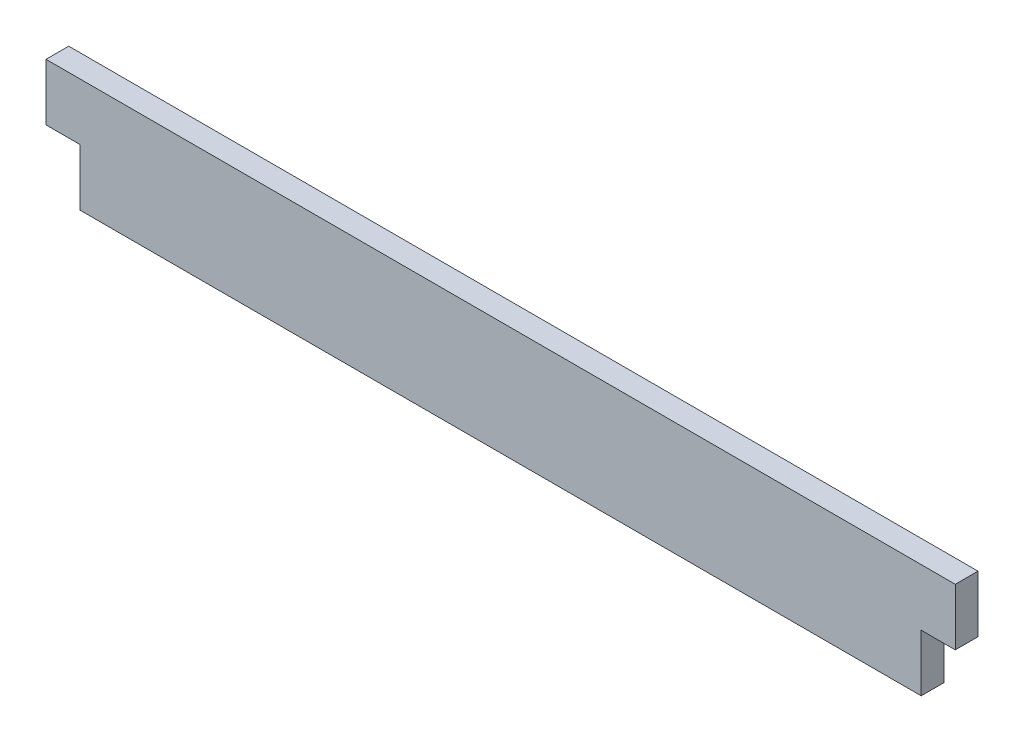
ISO-10303-21;
HEADER;
FILE_DESCRIPTION(('STEP AP214'),'2;1');
FILE_NAME('part.step','',(''),(''),'','','');
FILE_SCHEMA(('AUTOMOTIVE_DESIGN { 1 0 10303 214 1 1 1 1 }'));
ENDSEC;
DATA;
#1=APPLICATION_CONTEXT('core data for automotive mechanical design processes');
#2=APPLICATION_PROTOCOL_DEFINITION('international standard','automotive_design',2000,#1);
#3=PRODUCT_CONTEXT('',#1,'mechanical');
#4=PRODUCT('Part','Part','',(#3));
#5=PRODUCT_RELATED_PRODUCT_CATEGORY('part','',(#4));
#6=PRODUCT_DEFINITION_FORMATION('','',#4);
#7=PRODUCT_DEFINITION_CONTEXT('part definition',#1,'design');
#8=PRODUCT_DEFINITION('design','',#6,#7);
#9=PRODUCT_DEFINITION_SHAPE('','',#8);
#10=(LENGTH_UNIT() NAMED_UNIT(*) SI_UNIT(.MILLI.,.METRE.));
#11=(NAMED_UNIT(*) PLANE_ANGLE_UNIT() SI_UNIT($,.RADIAN.));
#12=(NAMED_UNIT(*) SI_UNIT($,.STERADIAN.) SOLID_ANGLE_UNIT());
#13=UNCERTAINTY_MEASURE_WITH_UNIT(LENGTH_MEASURE(1.E-05),#10,'distance_accuracy_value','');
#14=(GEOMETRIC_REPRESENTATION_CONTEXT(3) GLOBAL_UNCERTAINTY_ASSIGNED_CONTEXT((#13)) GLOBAL_UNIT_ASSIGNED_CONTEXT((#10,
#11,#12)) REPRESENTATION_CONTEXT('',''));
#15=CARTESIAN_POINT('',(0.,0.,0.));
#16=DIRECTION('',(0.,0.,1.));
#17=DIRECTION('',(1.,0.,0.));
#18=AXIS2_PLACEMENT_3D('',#15,#16,#17);
#19=CARTESIAN_POINT('',(-40.,-5.,2.));
#20=DIRECTION('',(1.,0.,0.));
#21=DIRECTION('',(0.,0.,-1.));
#22=AXIS2_PLACEMENT_3D('',#19,#20,#21);
#23=PLANE('',#22);
#24=DIRECTION('',(0.,-1.,0.));
#25=VECTOR('',#24,1.);
#26=CARTESIAN_POINT('',(-40.,-5.,0.));
#27=LINE('',#26,#25);
#28=CARTESIAN_POINT('',(-40.,5.,0.));
#29=VERTEX_POINT('',#28);
#30=CARTESIAN_POINT('',(-40.,0.,0.));
#31=VERTEX_POINT('',#30);
#32=EDGE_CURVE('E131',#29,#31,#27,.T.);
#33=ORIENTED_EDGE('',*,*,#32,.T.);
#34=DIRECTION('',(0.,0.,-1.));
#35=VECTOR('',#34,1.);
#36=CARTESIAN_POINT('',(-40.,0.,2.));
#37=LINE('',#36,#35);
#38=CARTESIAN_POINT('',(-40.,0.,2.));
#39=VERTEX_POINT('',#38);
#40=EDGE_CURVE('E54',#39,#31,#37,.T.);
#41=ORIENTED_EDGE('',*,*,#40,.F.);
#42=DIRECTION('',(0.,-1.,0.));
#43=VECTOR('',#42,1.);
#44=CARTESIAN_POINT('',(-40.,-5.,2.));
#45=LINE('',#44,#43);
#46=CARTESIAN_POINT('',(-40.,5.,2.));
#47=VERTEX_POINT('',#46);
#48=EDGE_CURVE('E121',#47,#39,#45,.T.);
#49=ORIENTED_EDGE('',*,*,#48,.F.);
#50=DIRECTION('',(0.,0.,-1.));
#51=VECTOR('',#50,1.);
#52=CARTESIAN_POINT('',(-40.,5.,2.));
#53=LINE('',#52,#51);
#54=EDGE_CURVE('E39',#47,#29,#53,.T.);
#55=ORIENTED_EDGE('',*,*,#54,.T.);
#56=EDGE_LOOP('',(#33,#41,#49,#55));
#57=FACE_BOUND('',#56,.T.);
#58=ADVANCED_FACE('F32',(#57),#23,.F.);
#59=CARTESIAN_POINT('',(40.,-4.99999999999999,2.));
#60=DIRECTION('',(0.,1.,0.));
#61=DIRECTION('',(-1.,0.,0.));
#62=AXIS2_PLACEMENT_3D('',#59,#60,#61);
#63=PLANE('',#62);
#64=DIRECTION('',(1.,0.,0.));
#65=VECTOR('',#64,1.);
#66=CARTESIAN_POINT('',(40.,-4.99999999999999,0.));
#67=LINE('',#66,#65);
#68=CARTESIAN_POINT('',(-37.,-5.,0.));
#69=VERTEX_POINT('',#68);
#70=CARTESIAN_POINT('',(37.,-4.99999999999999,0.));
#71=VERTEX_POINT('',#70);
#72=EDGE_CURVE('E113',#69,#71,#67,.T.);
#73=ORIENTED_EDGE('',*,*,#72,.T.);
#74=DIRECTION('',(0.,0.,-1.));
#75=VECTOR('',#74,1.);
#76=CARTESIAN_POINT('',(37.,-4.9999999999999,2.));
#77=LINE('',#76,#75);
#78=CARTESIAN_POINT('',(37.,-4.9999999999999,2.));
#79=VERTEX_POINT('',#78);
#80=EDGE_CURVE('E46',#79,#71,#77,.T.);
#81=ORIENTED_EDGE('',*,*,#80,.F.);
#82=DIRECTION('',(1.,0.,0.));
#83=VECTOR('',#82,1.);
#84=CARTESIAN_POINT('',(40.,-4.99999999999999,2.));
#85=LINE('',#84,#83);
#86=CARTESIAN_POINT('',(-37.,-5.,2.));
#87=VERTEX_POINT('',#86);
#88=EDGE_CURVE('E111',#87,#79,#85,.T.);
#89=ORIENTED_EDGE('',*,*,#88,.F.);
#90=DIRECTION('',(0.,0.,-1.));
#91=VECTOR('',#90,1.);
#92=CARTESIAN_POINT('',(-37.,-5.,2.));
#93=LINE('',#92,#91);
#94=EDGE_CURVE('E134',#87,#69,#93,.T.);
#95=ORIENTED_EDGE('',*,*,#94,.T.);
#96=EDGE_LOOP('',(#73,#81,#89,#95));
#97=FACE_BOUND('',#96,.T.);
#98=ADVANCED_FACE('F109',(#97),#63,.F.);
#99=CARTESIAN_POINT('',(40.,-4.99999999999999,2.));
#100=DIRECTION('',(-1.,0.,0.));
#101=DIRECTION('',(0.,0.,1.));
#102=AXIS2_PLACEMENT_3D('',#99,#100,#101);
#103=PLANE('',#102);
#104=DIRECTION('',(0.,1.,0.));
#105=VECTOR('',#104,1.);
#106=CARTESIAN_POINT('',(40.,-4.99999999999999,2.));
#107=LINE('',#106,#105);
#108=CARTESIAN_POINT('',(40.,1.06685493772574E-13,2.));
#109=VERTEX_POINT('',#108);
#110=CARTESIAN_POINT('',(40.,5.00000000000001,2.));
#111=VERTEX_POINT('',#110);
#112=EDGE_CURVE('E120',#109,#111,#107,.T.);
#113=ORIENTED_EDGE('',*,*,#112,.F.);
#114=DIRECTION('',(0.,0.,-1.));
#115=VECTOR('',#114,1.);
#116=CARTESIAN_POINT('',(40.,1.06685493772574E-13,2.));
#117=LINE('',#116,#115);
#118=CARTESIAN_POINT('',(40.,1.06685493772574E-13,0.));
#119=VERTEX_POINT('',#118);
#120=EDGE_CURVE('E152',#109,#119,#117,.T.);
#121=ORIENTED_EDGE('',*,*,#120,.T.);
#122=DIRECTION('',(0.,1.,0.));
#123=VECTOR('',#122,1.);
#124=CARTESIAN_POINT('',(40.,-4.99999999999999,0.));
#125=LINE('',#124,#123);
#126=CARTESIAN_POINT('',(40.,5.00000000000001,0.));
#127=VERTEX_POINT('',#126);
#128=EDGE_CURVE('E136',#119,#127,#125,.T.);
#129=ORIENTED_EDGE('',*,*,#128,.T.);
#130=DIRECTION('',(0.,0.,-1.));
#131=VECTOR('',#130,1.);
#132=CARTESIAN_POINT('',(40.,5.00000000000001,2.));
#133=LINE('',#132,#131);
#134=EDGE_CURVE('E11',#111,#127,#133,.T.);
#135=ORIENTED_EDGE('',*,*,#134,.F.);
#136=EDGE_LOOP('',(#113,#121,#129,#135));
#137=FACE_BOUND('',#136,.T.);
#138=ADVANCED_FACE('F172',(#137),#103,.F.);
#139=CARTESIAN_POINT('',(40.,5.00000000000001,2.));
#140=DIRECTION('',(0.,-1.,0.));
#141=DIRECTION('',(1.,0.,0.));
#142=AXIS2_PLACEMENT_3D('',#139,#140,#141);
#143=PLANE('',#142);
#144=DIRECTION('',(-1.,0.,0.));
#145=VECTOR('',#144,1.);
#146=CARTESIAN_POINT('',(40.,5.00000000000001,0.));
#147=LINE('',#146,#145);
#148=EDGE_CURVE('E126',#127,#29,#147,.T.);
#149=ORIENTED_EDGE('',*,*,#148,.T.);
#150=ORIENTED_EDGE('',*,*,#54,.F.);
#151=DIRECTION('',(-1.,0.,0.));
#152=VECTOR('',#151,1.);
#153=CARTESIAN_POINT('',(40.,5.00000000000001,2.));
#154=LINE('',#153,#152);
#155=EDGE_CURVE('E123',#111,#47,#154,.T.);
#156=ORIENTED_EDGE('',*,*,#155,.F.);
#157=ORIENTED_EDGE('',*,*,#134,.T.);
#158=EDGE_LOOP('',(#149,#150,#156,#157));
#159=FACE_BOUND('',#158,.T.);
#160=ADVANCED_FACE('F173',(#159),#143,.F.);
#161=CARTESIAN_POINT('',(0.,0.,2.));
#162=DIRECTION('',(0.,0.,1.));
#163=DIRECTION('',(1.,0.,0.));
#164=AXIS2_PLACEMENT_3D('',#161,#162,#163);
#165=PLANE('',#164);
#166=DIRECTION('',(1.,0.,0.));
#167=VECTOR('',#166,1.);
#168=CARTESIAN_POINT('',(40.,1.06685493772574E-13,2.));
#169=LINE('',#168,#167);
#170=CARTESIAN_POINT('',(37.,0.,2.));
#171=VERTEX_POINT('',#170);
#172=EDGE_CURVE('E103',#171,#109,#169,.T.);
#173=ORIENTED_EDGE('',*,*,#172,.T.);
#174=ORIENTED_EDGE('',*,*,#112,.T.);
#175=ORIENTED_EDGE('',*,*,#155,.T.);
#176=ORIENTED_EDGE('',*,*,#48,.T.);
#177=DIRECTION('',(1.,0.,0.));
#178=VECTOR('',#177,1.);
#179=CARTESIAN_POINT('',(-40.,0.,2.));
#180=LINE('',#179,#178);
#181=CARTESIAN_POINT('',(-37.,0.,2.));
#182=VERTEX_POINT('',#181);
#183=EDGE_CURVE('E154',#39,#182,#180,.T.);
#184=ORIENTED_EDGE('',*,*,#183,.T.);
#185=DIRECTION('',(0.,-1.,0.));
#186=VECTOR('',#185,1.);
#187=CARTESIAN_POINT('',(-37.,0.,2.));
#188=LINE('',#187,#186);
#189=EDGE_CURVE('E119',#182,#87,#188,.T.);
#190=ORIENTED_EDGE('',*,*,#189,.T.);
#191=ORIENTED_EDGE('',*,*,#88,.T.);
#192=DIRECTION('',(0.,1.,0.));
#193=VECTOR('',#192,1.);
#194=CARTESIAN_POINT('',(37.,0.,2.));
#195=LINE('',#194,#193);
#196=EDGE_CURVE('E96',#79,#171,#195,.T.);
#197=ORIENTED_EDGE('',*,*,#196,.T.);
#198=EDGE_LOOP('',(#173,#174,#175,#176,#184,#190,#191,#197));
#199=FACE_BOUND('',#198,.T.);
#200=ADVANCED_FACE('F116',(#199),#165,.T.);
#201=CARTESIAN_POINT('',(0.,0.,0.));
#202=DIRECTION('',(0.,0.,1.));
#203=DIRECTION('',(1.,0.,0.));
#204=AXIS2_PLACEMENT_3D('',#201,#202,#203);
#205=PLANE('',#204);
#206=ORIENTED_EDGE('',*,*,#128,.F.);
#207=DIRECTION('',(1.,0.,0.));
#208=VECTOR('',#207,1.);
#209=CARTESIAN_POINT('',(40.,1.06685493772574E-13,0.));
#210=LINE('',#209,#208);
#211=CARTESIAN_POINT('',(37.,0.,0.));
#212=VERTEX_POINT('',#211);
#213=EDGE_CURVE('E104',#212,#119,#210,.T.);
#214=ORIENTED_EDGE('',*,*,#213,.F.);
#215=DIRECTION('',(0.,1.,0.));
#216=VECTOR('',#215,1.);
#217=CARTESIAN_POINT('',(37.,0.,0.));
#218=LINE('',#217,#216);
#219=EDGE_CURVE('E166',#71,#212,#218,.T.);
#220=ORIENTED_EDGE('',*,*,#219,.F.);
#221=ORIENTED_EDGE('',*,*,#72,.F.);
#222=DIRECTION('',(0.,-1.,0.));
#223=VECTOR('',#222,1.);
#224=CARTESIAN_POINT('',(-37.,0.,0.));
#225=LINE('',#224,#223);
#226=CARTESIAN_POINT('',(-37.,0.,0.));
#227=VERTEX_POINT('',#226);
#228=EDGE_CURVE('E151',#227,#69,#225,.T.);
#229=ORIENTED_EDGE('',*,*,#228,.F.);
#230=DIRECTION('',(1.,0.,0.));
#231=VECTOR('',#230,1.);
#232=CARTESIAN_POINT('',(-40.,0.,0.));
#233=LINE('',#232,#231);
#234=EDGE_CURVE('E150',#31,#227,#233,.T.);
#235=ORIENTED_EDGE('',*,*,#234,.F.);
#236=ORIENTED_EDGE('',*,*,#32,.F.);
#237=ORIENTED_EDGE('',*,*,#148,.F.);
#238=EDGE_LOOP('',(#206,#214,#220,#221,#229,#235,#236,#237));
#239=FACE_BOUND('',#238,.T.);
#240=ADVANCED_FACE('F148',(#239),#205,.F.);
#241=CARTESIAN_POINT('',(-37.,0.,2.));
#242=DIRECTION('',(1.,0.,0.));
#243=DIRECTION('',(0.,0.,-1.));
#244=AXIS2_PLACEMENT_3D('',#241,#242,#243);
#245=PLANE('',#244);
#246=ORIENTED_EDGE('',*,*,#228,.T.);
#247=ORIENTED_EDGE('',*,*,#94,.F.);
#248=ORIENTED_EDGE('',*,*,#189,.F.);
#249=DIRECTION('',(0.,0.,-1.));
#250=VECTOR('',#249,1.);
#251=CARTESIAN_POINT('',(-37.,0.,2.));
#252=LINE('',#251,#250);
#253=EDGE_CURVE('E162',#182,#227,#252,.T.);
#254=ORIENTED_EDGE('',*,*,#253,.T.);
#255=EDGE_LOOP('',(#246,#247,#248,#254));
#256=FACE_BOUND('',#255,.T.);
#257=ADVANCED_FACE('F209',(#256),#245,.F.);
#258=CARTESIAN_POINT('',(-40.,0.,2.));
#259=DIRECTION('',(0.,1.,0.));
#260=DIRECTION('',(-1.,0.,0.));
#261=AXIS2_PLACEMENT_3D('',#258,#259,#260);
#262=PLANE('',#261);
#263=ORIENTED_EDGE('',*,*,#234,.T.);
#264=ORIENTED_EDGE('',*,*,#253,.F.);
#265=ORIENTED_EDGE('',*,*,#183,.F.);
#266=ORIENTED_EDGE('',*,*,#40,.T.);
#267=EDGE_LOOP('',(#263,#264,#265,#266));
#268=FACE_BOUND('',#267,.T.);
#269=ADVANCED_FACE('F217',(#268),#262,.F.);
#270=CARTESIAN_POINT('',(40.,1.06685493772574E-13,2.));
#271=DIRECTION('',(0.,1.,0.));
#272=DIRECTION('',(-1.,0.,0.));
#273=AXIS2_PLACEMENT_3D('',#270,#271,#272);
#274=PLANE('',#273);
#275=ORIENTED_EDGE('',*,*,#213,.T.);
#276=ORIENTED_EDGE('',*,*,#120,.F.);
#277=ORIENTED_EDGE('',*,*,#172,.F.);
#278=DIRECTION('',(0.,0.,-1.));
#279=VECTOR('',#278,1.);
#280=CARTESIAN_POINT('',(37.,0.,2.));
#281=LINE('',#280,#279);
#282=EDGE_CURVE('E98',#171,#212,#281,.T.);
#283=ORIENTED_EDGE('',*,*,#282,.T.);
#284=EDGE_LOOP('',(#275,#276,#277,#283));
#285=FACE_BOUND('',#284,.T.);
#286=ADVANCED_FACE('F227',(#285),#274,.F.);
#287=CARTESIAN_POINT('',(37.,0.,2.));
#288=DIRECTION('',(-1.,0.,0.));
#289=DIRECTION('',(0.,-1.,0.));
#290=AXIS2_PLACEMENT_3D('',#287,#288,#289);
#291=PLANE('',#290);
#292=ORIENTED_EDGE('',*,*,#219,.T.);
#293=ORIENTED_EDGE('',*,*,#282,.F.);
#294=ORIENTED_EDGE('',*,*,#196,.F.);
#295=ORIENTED_EDGE('',*,*,#80,.T.);
#296=EDGE_LOOP('',(#292,#293,#294,#295));
#297=FACE_BOUND('',#296,.T.);
#298=ADVANCED_FACE('F97',(#297),#291,.F.);
#299=CLOSED_SHELL('',(#58,#98,#138,#160,#200,#240,#257,#269,#286,#298));
#300=MANIFOLD_SOLID_BREP('B2',#299);
#301=ADVANCED_BREP_SHAPE_REPRESENTATION('',(#18,#300),#14);
#302=SHAPE_DEFINITION_REPRESENTATION(#9,#301);
ENDSEC;
END-ISO-10303-21;
